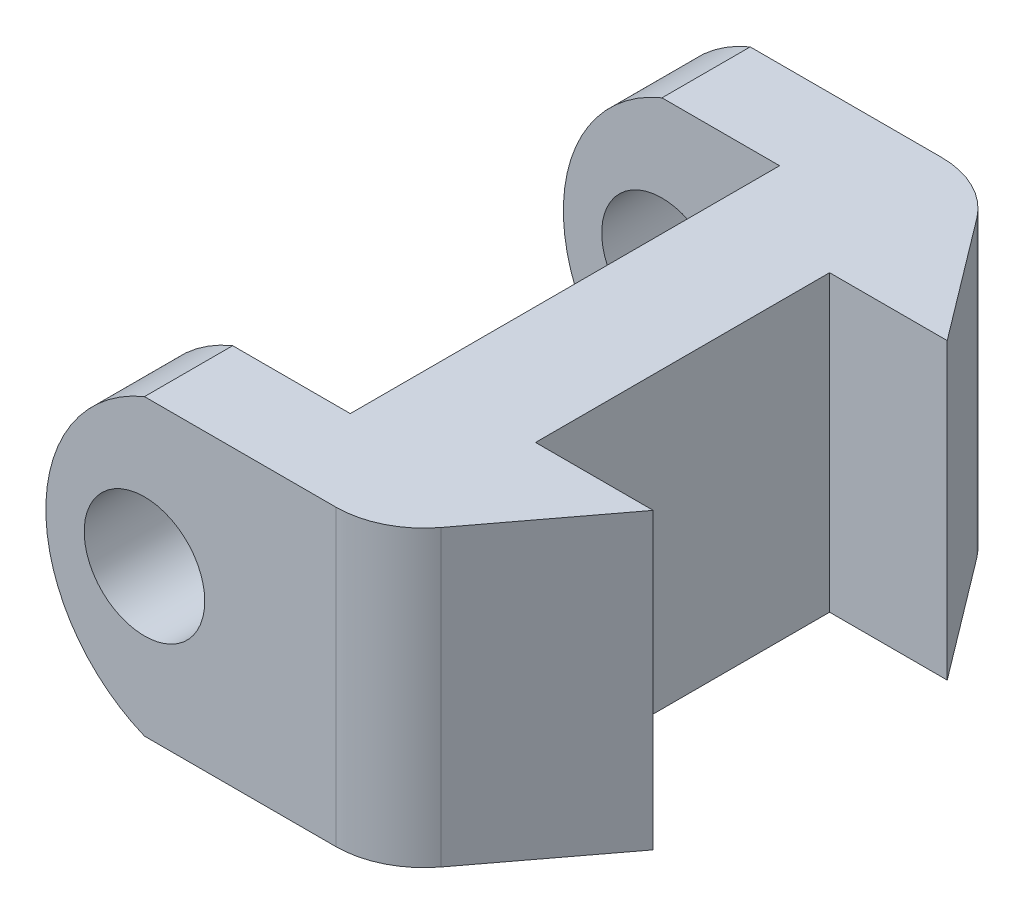
ISO-10303-21;
HEADER;
FILE_DESCRIPTION(('STEP AP214'),'2;1');
FILE_NAME('part.step','',(''),(''),'','','');
FILE_SCHEMA(('AUTOMOTIVE_DESIGN { 1 0 10303 214 1 1 1 1 }'));
ENDSEC;
DATA;
#1=APPLICATION_CONTEXT('core data for automotive mechanical design processes');
#2=APPLICATION_PROTOCOL_DEFINITION('international standard','automotive_design',2000,#1);
#3=PRODUCT_CONTEXT('',#1,'mechanical');
#4=PRODUCT('Part','Part','',(#3));
#5=PRODUCT_RELATED_PRODUCT_CATEGORY('part','',(#4));
#6=PRODUCT_DEFINITION_FORMATION('','',#4);
#7=PRODUCT_DEFINITION_CONTEXT('part definition',#1,'design');
#8=PRODUCT_DEFINITION('design','',#6,#7);
#9=PRODUCT_DEFINITION_SHAPE('','',#8);
#10=(LENGTH_UNIT() NAMED_UNIT(*) SI_UNIT(.MILLI.,.METRE.));
#11=(NAMED_UNIT(*) PLANE_ANGLE_UNIT() SI_UNIT($,.RADIAN.));
#12=(NAMED_UNIT(*) SI_UNIT($,.STERADIAN.) SOLID_ANGLE_UNIT());
#13=UNCERTAINTY_MEASURE_WITH_UNIT(LENGTH_MEASURE(1.E-05),#10,'distance_accuracy_value','');
#14=(GEOMETRIC_REPRESENTATION_CONTEXT(3) GLOBAL_UNCERTAINTY_ASSIGNED_CONTEXT((#13)) GLOBAL_UNIT_ASSIGNED_CONTEXT((#10,
#11,#12)) REPRESENTATION_CONTEXT('',''));
#15=CARTESIAN_POINT('',(0.,0.,0.));
#16=DIRECTION('',(0.,0.,1.));
#17=DIRECTION('',(1.,0.,0.));
#18=AXIS2_PLACEMENT_3D('',#15,#16,#17);
#19=CARTESIAN_POINT('',(0.,10.,-7.3));
#20=DIRECTION('',(0.,0.,1.));
#21=DIRECTION('',(1.,0.,0.));
#22=AXIS2_PLACEMENT_3D('',#19,#20,#21);
#23=PLANE('',#22);
#24=CARTESIAN_POINT('',(0.0499999999999997,5.,-7.3));
#25=DIRECTION('',(0.,0.,1.));
#26=DIRECTION('',(1.,0.,0.));
#27=AXIS2_PLACEMENT_3D('',#24,#25,#26);
#28=CIRCLE('',#27,5.40393375236966);
#29=CARTESIAN_POINT('',(-2.,0.,-7.29999999999999));
#30=VERTEX_POINT('',#29);
#31=CARTESIAN_POINT('',(-2.,10.,-7.29999999999999));
#32=VERTEX_POINT('',#31);
#33=EDGE_CURVE('E174',#30,#32,#28,.F.);
#34=ORIENTED_EDGE('',*,*,#33,.F.);
#35=DIRECTION('',(-1.,0.,0.));
#36=VECTOR('',#35,1.);
#37=CARTESIAN_POINT('',(0.,0.,-7.3));
#38=LINE('',#37,#36);
#39=CARTESIAN_POINT('',(2.,0.,-7.3));
#40=VERTEX_POINT('',#39);
#41=EDGE_CURVE('E222',#40,#30,#38,.T.);
#42=ORIENTED_EDGE('',*,*,#41,.F.);
#43=DIRECTION('',(0.,-1.,0.));
#44=VECTOR('',#43,1.);
#45=CARTESIAN_POINT('',(2.,10.,-7.3));
#46=LINE('',#45,#44);
#47=CARTESIAN_POINT('',(2.,10.,-7.3));
#48=VERTEX_POINT('',#47);
#49=EDGE_CURVE('E195',#48,#40,#46,.T.);
#50=ORIENTED_EDGE('',*,*,#49,.F.);
#51=DIRECTION('',(-1.,0.,0.));
#52=VECTOR('',#51,1.);
#53=CARTESIAN_POINT('',(0.,10.,-7.3));
#54=LINE('',#53,#52);
#55=EDGE_CURVE('E206',#48,#32,#54,.T.);
#56=ORIENTED_EDGE('',*,*,#55,.T.);
#57=EDGE_LOOP('',(#34,#42,#50,#56));
#58=FACE_BOUND('',#57,.T.);
#59=CARTESIAN_POINT('',(-2.,5.,-7.3));
#60=DIRECTION('',(0.,0.,1.));
#61=DIRECTION('',(1.,0.,0.));
#62=AXIS2_PLACEMENT_3D('',#59,#60,#61);
#63=CIRCLE('',#62,2.05);
#64=CARTESIAN_POINT('',(0.0500000000000006,5.,-7.3));
#65=VERTEX_POINT('',#64);
#66=EDGE_CURVE('E226',#65,#65,#63,.T.);
#67=ORIENTED_EDGE('',*,*,#66,.F.);
#68=EDGE_LOOP('',(#67));
#69=FACE_BOUND('',#68,.T.);
#70=ADVANCED_FACE('F41',(#58,#69),#23,.T.);
#71=CARTESIAN_POINT('',(2.,10.,0.));
#72=DIRECTION('',(-1.,0.,0.));
#73=DIRECTION('',(0.,0.,1.));
#74=AXIS2_PLACEMENT_3D('',#71,#72,#73);
#75=PLANE('',#74);
#76=DIRECTION('',(0.,0.,-1.));
#77=VECTOR('',#76,1.);
#78=CARTESIAN_POINT('',(2.,0.,0.));
#79=LINE('',#78,#77);
#80=CARTESIAN_POINT('',(2.,0.,7.3));
#81=VERTEX_POINT('',#80);
#82=EDGE_CURVE('E218',#81,#40,#79,.T.);
#83=ORIENTED_EDGE('',*,*,#82,.F.);
#84=DIRECTION('',(0.,-1.,0.));
#85=VECTOR('',#84,1.);
#86=CARTESIAN_POINT('',(2.,10.,7.3));
#87=LINE('',#86,#85);
#88=CARTESIAN_POINT('',(2.,10.,7.3));
#89=VERTEX_POINT('',#88);
#90=EDGE_CURVE('E198',#89,#81,#87,.T.);
#91=ORIENTED_EDGE('',*,*,#90,.F.);
#92=DIRECTION('',(0.,0.,-1.));
#93=VECTOR('',#92,1.);
#94=CARTESIAN_POINT('',(2.,10.,0.));
#95=LINE('',#94,#93);
#96=EDGE_CURVE('E239',#89,#48,#95,.T.);
#97=ORIENTED_EDGE('',*,*,#96,.T.);
#98=ORIENTED_EDGE('',*,*,#49,.T.);
#99=EDGE_LOOP('',(#83,#91,#97,#98));
#100=FACE_BOUND('',#99,.T.);
#101=ADVANCED_FACE('F353',(#100),#75,.T.);
#102=CARTESIAN_POINT('',(0.,10.,7.3));
#103=DIRECTION('',(0.,0.,1.));
#104=DIRECTION('',(1.,0.,0.));
#105=AXIS2_PLACEMENT_3D('',#102,#103,#104);
#106=PLANE('',#105);
#107=CARTESIAN_POINT('',(-2.,5.,7.3));
#108=DIRECTION('',(0.,0.,1.));
#109=DIRECTION('',(1.,0.,0.));
#110=AXIS2_PLACEMENT_3D('',#107,#108,#109);
#111=CIRCLE('',#110,2.05);
#112=CARTESIAN_POINT('',(0.0500000000000006,5.,7.3));
#113=VERTEX_POINT('',#112);
#114=EDGE_CURVE('E249',#113,#113,#111,.T.);
#115=ORIENTED_EDGE('',*,*,#114,.T.);
#116=EDGE_LOOP('',(#115));
#117=FACE_BOUND('',#116,.T.);
#118=DIRECTION('',(-1.,0.,0.));
#119=VECTOR('',#118,1.);
#120=CARTESIAN_POINT('',(0.,0.,7.3));
#121=LINE('',#120,#119);
#122=CARTESIAN_POINT('',(-1.99999999999999,0.,7.3));
#123=VERTEX_POINT('',#122);
#124=EDGE_CURVE('E214',#81,#123,#121,.T.);
#125=ORIENTED_EDGE('',*,*,#124,.T.);
#126=CARTESIAN_POINT('',(0.0499999999999997,5.,7.3));
#127=DIRECTION('',(0.,0.,1.));
#128=DIRECTION('',(1.,0.,0.));
#129=AXIS2_PLACEMENT_3D('',#126,#127,#128);
#130=CIRCLE('',#129,5.40393375236966);
#131=CARTESIAN_POINT('',(-2.,10.,7.3));
#132=VERTEX_POINT('',#131);
#133=EDGE_CURVE('E59',#123,#132,#130,.F.);
#134=ORIENTED_EDGE('',*,*,#133,.T.);
#135=DIRECTION('',(-1.,0.,0.));
#136=VECTOR('',#135,1.);
#137=CARTESIAN_POINT('',(0.,10.,7.3));
#138=LINE('',#137,#136);
#139=EDGE_CURVE('E235',#89,#132,#138,.T.);
#140=ORIENTED_EDGE('',*,*,#139,.F.);
#141=ORIENTED_EDGE('',*,*,#90,.T.);
#142=EDGE_LOOP('',(#125,#134,#140,#141));
#143=FACE_BOUND('',#142,.T.);
#144=ADVANCED_FACE('F356',(#117,#143),#106,.F.);
#145=CARTESIAN_POINT('',(0.,10.,10.3));
#146=DIRECTION('',(0.,0.,1.));
#147=DIRECTION('',(1.,0.,0.));
#148=AXIS2_PLACEMENT_3D('',#145,#146,#147);
#149=PLANE('',#148);
#150=CARTESIAN_POINT('',(0.0499999999999997,5.,10.3));
#151=DIRECTION('',(0.,0.,1.));
#152=DIRECTION('',(1.,0.,0.));
#153=AXIS2_PLACEMENT_3D('',#150,#151,#152);
#154=CIRCLE('',#153,5.40393375236966);
#155=CARTESIAN_POINT('',(-2.,10.,10.3));
#156=VERTEX_POINT('',#155);
#157=CARTESIAN_POINT('',(-2.,0.,10.3));
#158=VERTEX_POINT('',#157);
#159=EDGE_CURVE('E307',#156,#158,#154,.T.);
#160=ORIENTED_EDGE('',*,*,#159,.T.);
#161=DIRECTION('',(-1.,0.,0.));
#162=VECTOR('',#161,1.);
#163=CARTESIAN_POINT('',(0.,0.,10.3));
#164=LINE('',#163,#162);
#165=CARTESIAN_POINT('',(4.50564332806777,0.,10.3));
#166=VERTEX_POINT('',#165);
#167=EDGE_CURVE('E210',#166,#158,#164,.T.);
#168=ORIENTED_EDGE('',*,*,#167,.F.);
#169=DIRECTION('',(0.,-1.,0.));
#170=VECTOR('',#169,1.);
#171=CARTESIAN_POINT('',(4.50564332806777,10.,10.3));
#172=LINE('',#171,#170);
#173=CARTESIAN_POINT('',(4.50564332806777,10.,10.3));
#174=VERTEX_POINT('',#173);
#175=EDGE_CURVE('E52',#166,#174,#172,.F.);
#176=ORIENTED_EDGE('',*,*,#175,.T.);
#177=DIRECTION('',(-1.,0.,0.));
#178=VECTOR('',#177,1.);
#179=CARTESIAN_POINT('',(0.,10.,10.3));
#180=LINE('',#179,#178);
#181=EDGE_CURVE('E158',#174,#156,#180,.T.);
#182=ORIENTED_EDGE('',*,*,#181,.T.);
#183=EDGE_LOOP('',(#160,#168,#176,#182));
#184=FACE_BOUND('',#183,.T.);
#185=CARTESIAN_POINT('',(-2.,5.,10.3));
#186=DIRECTION('',(0.,0.,1.));
#187=DIRECTION('',(1.,0.,0.));
#188=AXIS2_PLACEMENT_3D('',#185,#186,#187);
#189=CIRCLE('',#188,2.05);
#190=CARTESIAN_POINT('',(0.0500000000000006,5.,10.3));
#191=VERTEX_POINT('',#190);
#192=EDGE_CURVE('E257',#191,#191,#189,.T.);
#193=ORIENTED_EDGE('',*,*,#192,.F.);
#194=EDGE_LOOP('',(#193));
#195=FACE_BOUND('',#194,.T.);
#196=ADVANCED_FACE('F315',(#184,#195),#149,.T.);
#197=CARTESIAN_POINT('',(6.,10.,0.));
#198=DIRECTION('',(-1.,0.,0.));
#199=DIRECTION('',(0.,0.,1.));
#200=AXIS2_PLACEMENT_3D('',#197,#198,#199);
#201=PLANE('',#200);
#202=DIRECTION('',(0.,0.,-1.));
#203=VECTOR('',#202,1.);
#204=CARTESIAN_POINT('',(6.,10.,0.));
#205=LINE('',#204,#203);
#206=CARTESIAN_POINT('',(6.,10.,5.));
#207=VERTEX_POINT('',#206);
#208=CARTESIAN_POINT('',(6.,10.,-5.));
#209=VERTEX_POINT('',#208);
#210=EDGE_CURVE('E230',#207,#209,#205,.T.);
#211=ORIENTED_EDGE('',*,*,#210,.F.);
#212=DIRECTION('',(0.,1.,0.));
#213=VECTOR('',#212,1.);
#214=CARTESIAN_POINT('',(6.,-6.64003012041361,5.));
#215=LINE('',#214,#213);
#216=CARTESIAN_POINT('',(6.,0.,5.));
#217=VERTEX_POINT('',#216);
#218=EDGE_CURVE('E291',#217,#207,#215,.T.);
#219=ORIENTED_EDGE('',*,*,#218,.F.);
#220=DIRECTION('',(0.,0.,-1.));
#221=VECTOR('',#220,1.);
#222=CARTESIAN_POINT('',(6.,0.,0.));
#223=LINE('',#222,#221);
#224=CARTESIAN_POINT('',(6.,0.,-5.));
#225=VERTEX_POINT('',#224);
#226=EDGE_CURVE('E207',#217,#225,#223,.T.);
#227=ORIENTED_EDGE('',*,*,#226,.T.);
#228=DIRECTION('',(0.,1.,0.));
#229=VECTOR('',#228,1.);
#230=CARTESIAN_POINT('',(6.,-6.64003012041361,-5.));
#231=LINE('',#230,#229);
#232=EDGE_CURVE('E266',#225,#209,#231,.T.);
#233=ORIENTED_EDGE('',*,*,#232,.T.);
#234=EDGE_LOOP('',(#211,#219,#227,#233));
#235=FACE_BOUND('',#234,.T.);
#236=ADVANCED_FACE('F332',(#235),#201,.F.);
#237=CARTESIAN_POINT('',(0.,10.,-10.3));
#238=DIRECTION('',(0.,0.,1.));
#239=DIRECTION('',(1.,0.,0.));
#240=AXIS2_PLACEMENT_3D('',#237,#238,#239);
#241=PLANE('',#240);
#242=CARTESIAN_POINT('',(-2.,5.,-10.3));
#243=DIRECTION('',(0.,0.,1.));
#244=DIRECTION('',(1.,0.,0.));
#245=AXIS2_PLACEMENT_3D('',#242,#243,#244);
#246=CIRCLE('',#245,2.05);
#247=CARTESIAN_POINT('',(0.0500000000000006,5.,-10.3));
#248=VERTEX_POINT('',#247);
#249=EDGE_CURVE('E253',#248,#248,#246,.T.);
#250=ORIENTED_EDGE('',*,*,#249,.T.);
#251=EDGE_LOOP('',(#250));
#252=FACE_BOUND('',#251,.T.);
#253=DIRECTION('',(-1.,0.,0.));
#254=VECTOR('',#253,1.);
#255=CARTESIAN_POINT('',(0.,0.,-10.3));
#256=LINE('',#255,#254);
#257=CARTESIAN_POINT('',(4.50564332806777,0.,-10.3));
#258=VERTEX_POINT('',#257);
#259=CARTESIAN_POINT('',(-1.99999999999999,0.,-10.3));
#260=VERTEX_POINT('',#259);
#261=EDGE_CURVE('E202',#258,#260,#256,.T.);
#262=ORIENTED_EDGE('',*,*,#261,.T.);
#263=CARTESIAN_POINT('',(0.0499999999999997,5.,-10.3));
#264=DIRECTION('',(0.,0.,-1.));
#265=DIRECTION('',(-1.,0.,0.));
#266=AXIS2_PLACEMENT_3D('',#263,#264,#265);
#267=CIRCLE('',#266,5.40393375236966);
#268=CARTESIAN_POINT('',(-2.,10.,-10.3));
#269=VERTEX_POINT('',#268);
#270=EDGE_CURVE('E45',#269,#260,#267,.F.);
#271=ORIENTED_EDGE('',*,*,#270,.F.);
#272=DIRECTION('',(-1.,0.,0.));
#273=VECTOR('',#272,1.);
#274=CARTESIAN_POINT('',(0.,10.,-10.3));
#275=LINE('',#274,#273);
#276=CARTESIAN_POINT('',(4.50564332806777,10.,-10.3));
#277=VERTEX_POINT('',#276);
#278=EDGE_CURVE('E201',#277,#269,#275,.T.);
#279=ORIENTED_EDGE('',*,*,#278,.F.);
#280=DIRECTION('',(0.,-1.,0.));
#281=VECTOR('',#280,1.);
#282=CARTESIAN_POINT('',(4.50564332806777,10.,-10.3));
#283=LINE('',#282,#281);
#284=EDGE_CURVE('E191',#277,#258,#283,.T.);
#285=ORIENTED_EDGE('',*,*,#284,.T.);
#286=EDGE_LOOP('',(#262,#271,#279,#285));
#287=FACE_BOUND('',#286,.T.);
#288=ADVANCED_FACE('F343',(#252,#287),#241,.F.);
#289=CARTESIAN_POINT('',(0.,10.,0.));
#290=DIRECTION('',(0.,1.,0.));
#291=DIRECTION('',(0.,0.,1.));
#292=AXIS2_PLACEMENT_3D('',#289,#290,#291);
#293=PLANE('',#292);
#294=DIRECTION('',(0.,0.,-1.));
#295=VECTOR('',#294,1.);
#296=CARTESIAN_POINT('',(-2.,10.,10.3));
#297=LINE('',#296,#295);
#298=EDGE_CURVE('E311',#156,#132,#297,.T.);
#299=ORIENTED_EDGE('',*,*,#298,.F.);
#300=ORIENTED_EDGE('',*,*,#181,.F.);
#301=CARTESIAN_POINT('',(4.50564332806777,10.,7.3));
#302=DIRECTION('',(0.,1.,0.));
#303=DIRECTION('',(0.,0.,1.));
#304=AXIS2_PLACEMENT_3D('',#301,#302,#303);
#305=CIRCLE('',#304,3.);
#306=CARTESIAN_POINT('',(6.90021077906746,10.,9.10722071773562));
#307=VERTEX_POINT('',#306);
#308=EDGE_CURVE('E151',#174,#307,#305,.T.);
#309=ORIENTED_EDGE('',*,*,#308,.T.);
#310=DIRECTION('',(-0.602406905911873,0.,0.79818915033323));
#311=VECTOR('',#310,1.);
#312=CARTESIAN_POINT('',(8.77523247902019,10.,6.62281696529826));
#313=LINE('',#312,#311);
#314=CARTESIAN_POINT('',(10.,10.,5.));
#315=VERTEX_POINT('',#314);
#316=EDGE_CURVE('E156',#315,#307,#313,.T.);
#317=ORIENTED_EDGE('',*,*,#316,.F.);
#318=DIRECTION('',(-1.,0.,0.));
#319=VECTOR('',#318,1.);
#320=CARTESIAN_POINT('',(0.,10.,5.));
#321=LINE('',#320,#319);
#322=EDGE_CURVE('E173',#315,#207,#321,.T.);
#323=ORIENTED_EDGE('',*,*,#322,.T.);
#324=ORIENTED_EDGE('',*,*,#210,.T.);
#325=DIRECTION('',(-1.,0.,0.));
#326=VECTOR('',#325,1.);
#327=CARTESIAN_POINT('',(0.,10.,-5.));
#328=LINE('',#327,#326);
#329=CARTESIAN_POINT('',(10.,10.,-5.));
#330=VERTEX_POINT('',#329);
#331=EDGE_CURVE('E277',#330,#209,#328,.T.);
#332=ORIENTED_EDGE('',*,*,#331,.F.);
#333=DIRECTION('',(0.602406905911873,0.,0.79818915033323));
#334=VECTOR('',#333,1.);
#335=CARTESIAN_POINT('',(8.77523247902019,10.,-6.62281696529826));
#336=LINE('',#335,#334);
#337=CARTESIAN_POINT('',(6.90021077906746,10.,-9.10722071773562));
#338=VERTEX_POINT('',#337);
#339=EDGE_CURVE('E271',#338,#330,#336,.T.);
#340=ORIENTED_EDGE('',*,*,#339,.F.);
#341=CARTESIAN_POINT('',(4.50564332806777,10.,-7.3));
#342=DIRECTION('',(0.,1.,0.));
#343=DIRECTION('',(0.,0.,1.));
#344=AXIS2_PLACEMENT_3D('',#341,#342,#343);
#345=CIRCLE('',#344,3.);
#346=EDGE_CURVE('E162',#338,#277,#345,.T.);
#347=ORIENTED_EDGE('',*,*,#346,.T.);
#348=ORIENTED_EDGE('',*,*,#278,.T.);
#349=EDGE_CURVE('E71',#32,#269,#297,.T.);
#350=ORIENTED_EDGE('',*,*,#349,.F.);
#351=ORIENTED_EDGE('',*,*,#55,.F.);
#352=ORIENTED_EDGE('',*,*,#96,.F.);
#353=ORIENTED_EDGE('',*,*,#139,.T.);
#354=EDGE_LOOP('',(#299,#300,#309,#317,#323,#324,#332,#340,#347,#348,#350,#351,#352,#353));
#355=FACE_BOUND('',#354,.T.);
#356=ADVANCED_FACE('F154',(#355),#293,.T.);
#357=CARTESIAN_POINT('',(0.,0.,0.));
#358=DIRECTION('',(0.,1.,0.));
#359=DIRECTION('',(0.,0.,1.));
#360=AXIS2_PLACEMENT_3D('',#357,#358,#359);
#361=PLANE('',#360);
#362=ORIENTED_EDGE('',*,*,#167,.T.);
#363=DIRECTION('',(0.,0.,-1.));
#364=VECTOR('',#363,1.);
#365=CARTESIAN_POINT('',(-2.,0.,10.3));
#366=LINE('',#365,#364);
#367=EDGE_CURVE('E76',#158,#123,#366,.T.);
#368=ORIENTED_EDGE('',*,*,#367,.T.);
#369=ORIENTED_EDGE('',*,*,#124,.F.);
#370=ORIENTED_EDGE('',*,*,#82,.T.);
#371=ORIENTED_EDGE('',*,*,#41,.T.);
#372=DIRECTION('',(0.,0.,-1.));
#373=VECTOR('',#372,1.);
#374=CARTESIAN_POINT('',(-1.99999999999999,0.,10.3));
#375=LINE('',#374,#373);
#376=EDGE_CURVE('E11',#30,#260,#375,.T.);
#377=ORIENTED_EDGE('',*,*,#376,.T.);
#378=ORIENTED_EDGE('',*,*,#261,.F.);
#379=CARTESIAN_POINT('',(4.50564332806777,0.,-7.3));
#380=DIRECTION('',(0.,1.,0.));
#381=DIRECTION('',(0.,0.,1.));
#382=AXIS2_PLACEMENT_3D('',#379,#380,#381);
#383=CIRCLE('',#382,3.);
#384=CARTESIAN_POINT('',(6.90021077906746,0.,-9.10722071773562));
#385=VERTEX_POINT('',#384);
#386=EDGE_CURVE('E186',#258,#385,#383,.F.);
#387=ORIENTED_EDGE('',*,*,#386,.T.);
#388=DIRECTION('',(-0.602406905911873,0.,-0.798189150333231));
#389=VECTOR('',#388,1.);
#390=CARTESIAN_POINT('',(8.77523247902019,0.,-6.62281696529826));
#391=LINE('',#390,#389);
#392=CARTESIAN_POINT('',(10.,0.,-5.));
#393=VERTEX_POINT('',#392);
#394=EDGE_CURVE('E262',#393,#385,#391,.T.);
#395=ORIENTED_EDGE('',*,*,#394,.F.);
#396=DIRECTION('',(1.,0.,0.));
#397=VECTOR('',#396,1.);
#398=CARTESIAN_POINT('',(0.,0.,-5.));
#399=LINE('',#398,#397);
#400=EDGE_CURVE('E261',#225,#393,#399,.T.);
#401=ORIENTED_EDGE('',*,*,#400,.F.);
#402=ORIENTED_EDGE('',*,*,#226,.F.);
#403=DIRECTION('',(1.,0.,0.));
#404=VECTOR('',#403,1.);
#405=CARTESIAN_POINT('',(0.,0.,5.));
#406=LINE('',#405,#404);
#407=CARTESIAN_POINT('',(10.,0.,5.));
#408=VERTEX_POINT('',#407);
#409=EDGE_CURVE('E281',#217,#408,#406,.T.);
#410=ORIENTED_EDGE('',*,*,#409,.T.);
#411=DIRECTION('',(0.602406905911873,0.,-0.798189150333231));
#412=VECTOR('',#411,1.);
#413=CARTESIAN_POINT('',(8.77523247902019,0.,6.62281696529826));
#414=LINE('',#413,#412);
#415=CARTESIAN_POINT('',(6.90021077906746,0.,9.10722071773562));
#416=VERTEX_POINT('',#415);
#417=EDGE_CURVE('E288',#416,#408,#414,.T.);
#418=ORIENTED_EDGE('',*,*,#417,.F.);
#419=CARTESIAN_POINT('',(4.50564332806777,0.,7.3));
#420=DIRECTION('',(0.,1.,0.));
#421=DIRECTION('',(0.,0.,1.));
#422=AXIS2_PLACEMENT_3D('',#419,#420,#421);
#423=CIRCLE('',#422,3.);
#424=EDGE_CURVE('E176',#416,#166,#423,.F.);
#425=ORIENTED_EDGE('',*,*,#424,.T.);
#426=EDGE_LOOP('',(#362,#368,#369,#370,#371,#377,#378,#387,#395,#401,#402,#410,#418,#425));
#427=FACE_BOUND('',#426,.T.);
#428=ADVANCED_FACE('F318',(#427),#361,.F.);
#429=CARTESIAN_POINT('',(-2.,5.,-10.3));
#430=DIRECTION('',(0.,0.,1.));
#431=DIRECTION('',(1.,0.,0.));
#432=AXIS2_PLACEMENT_3D('',#429,#430,#431);
#433=CYLINDRICAL_SURFACE('',#432,2.05);
#434=ORIENTED_EDGE('',*,*,#66,.T.);
#435=EDGE_LOOP('',(#434));
#436=FACE_BOUND('',#435,.T.);
#437=ORIENTED_EDGE('',*,*,#249,.F.);
#438=EDGE_LOOP('',(#437));
#439=FACE_BOUND('',#438,.T.);
#440=ADVANCED_FACE('F386',(#436,#439),#433,.F.);
#441=ORIENTED_EDGE('',*,*,#192,.T.);
#442=EDGE_LOOP('',(#441));
#443=FACE_BOUND('',#442,.T.);
#444=ORIENTED_EDGE('',*,*,#114,.F.);
#445=EDGE_LOOP('',(#444));
#446=FACE_BOUND('',#445,.T.);
#447=ADVANCED_FACE('F383',(#443,#446),#433,.F.);
#448=CARTESIAN_POINT('',(8.77523247902019,-6.64003012041361,-6.62281696529826));
#449=DIRECTION('',(-0.79818915033323,0.,0.602406905911873));
#450=DIRECTION('',(0.602406905911873,0.,0.798189150333231));
#451=AXIS2_PLACEMENT_3D('',#448,#449,#450);
#452=PLANE('',#451);
#453=ORIENTED_EDGE('',*,*,#394,.T.);
#454=DIRECTION('',(0.,-1.,0.));
#455=VECTOR('',#454,1.);
#456=CARTESIAN_POINT('',(6.90021077906746,-6.64003012041361,-9.10722071773562));
#457=LINE('',#456,#455);
#458=EDGE_CURVE('E163',#385,#338,#457,.F.);
#459=ORIENTED_EDGE('',*,*,#458,.T.);
#460=ORIENTED_EDGE('',*,*,#339,.T.);
#461=DIRECTION('',(0.,1.,0.));
#462=VECTOR('',#461,1.);
#463=CARTESIAN_POINT('',(10.,-6.64003012041361,-5.));
#464=LINE('',#463,#462);
#465=EDGE_CURVE('E267',#393,#330,#464,.T.);
#466=ORIENTED_EDGE('',*,*,#465,.F.);
#467=EDGE_LOOP('',(#453,#459,#460,#466));
#468=FACE_BOUND('',#467,.T.);
#469=ADVANCED_FACE('F334',(#468),#452,.F.);
#470=CARTESIAN_POINT('',(0.,-6.64003012041361,-5.));
#471=DIRECTION('',(0.,0.,-1.));
#472=DIRECTION('',(-1.,0.,0.));
#473=AXIS2_PLACEMENT_3D('',#470,#471,#472);
#474=PLANE('',#473);
#475=ORIENTED_EDGE('',*,*,#232,.F.);
#476=ORIENTED_EDGE('',*,*,#400,.T.);
#477=ORIENTED_EDGE('',*,*,#465,.T.);
#478=ORIENTED_EDGE('',*,*,#331,.T.);
#479=EDGE_LOOP('',(#475,#476,#477,#478));
#480=FACE_BOUND('',#479,.T.);
#481=ADVANCED_FACE('F330',(#480),#474,.F.);
#482=CARTESIAN_POINT('',(8.77523247902019,-6.64003012041361,6.62281696529826));
#483=DIRECTION('',(-0.79818915033323,0.,-0.602406905911873));
#484=DIRECTION('',(-0.602406905911873,0.,0.798189150333231));
#485=AXIS2_PLACEMENT_3D('',#482,#483,#484);
#486=PLANE('',#485);
#487=ORIENTED_EDGE('',*,*,#316,.T.);
#488=DIRECTION('',(0.,-1.,0.));
#489=VECTOR('',#488,1.);
#490=CARTESIAN_POINT('',(6.90021077906746,0.,9.10722071773562));
#491=LINE('',#490,#489);
#492=EDGE_CURVE('E168',#307,#416,#491,.T.);
#493=ORIENTED_EDGE('',*,*,#492,.T.);
#494=ORIENTED_EDGE('',*,*,#417,.T.);
#495=DIRECTION('',(0.,1.,0.));
#496=VECTOR('',#495,1.);
#497=CARTESIAN_POINT('',(10.,-6.64003012041361,5.));
#498=LINE('',#497,#496);
#499=EDGE_CURVE('E171',#408,#315,#498,.T.);
#500=ORIENTED_EDGE('',*,*,#499,.T.);
#501=EDGE_LOOP('',(#487,#493,#494,#500));
#502=FACE_BOUND('',#501,.T.);
#503=ADVANCED_FACE('F167',(#502),#486,.F.);
#504=CARTESIAN_POINT('',(0.,-6.64003012041361,5.));
#505=DIRECTION('',(0.,0.,-1.));
#506=DIRECTION('',(-1.,0.,0.));
#507=AXIS2_PLACEMENT_3D('',#504,#505,#506);
#508=PLANE('',#507);
#509=ORIENTED_EDGE('',*,*,#409,.F.);
#510=ORIENTED_EDGE('',*,*,#218,.T.);
#511=ORIENTED_EDGE('',*,*,#322,.F.);
#512=ORIENTED_EDGE('',*,*,#499,.F.);
#513=EDGE_LOOP('',(#509,#510,#511,#512));
#514=FACE_BOUND('',#513,.T.);
#515=ADVANCED_FACE('F324',(#514),#508,.T.);
#516=CARTESIAN_POINT('',(4.50564332806777,10.,-7.3));
#517=DIRECTION('',(0.,-1.,0.));
#518=DIRECTION('',(0.,0.,-1.));
#519=AXIS2_PLACEMENT_3D('',#516,#517,#518);
#520=CYLINDRICAL_SURFACE('',#519,3.);
#521=ORIENTED_EDGE('',*,*,#346,.F.);
#522=ORIENTED_EDGE('',*,*,#458,.F.);
#523=ORIENTED_EDGE('',*,*,#386,.F.);
#524=ORIENTED_EDGE('',*,*,#284,.F.);
#525=EDGE_LOOP('',(#521,#522,#523,#524));
#526=FACE_BOUND('',#525,.T.);
#527=ADVANCED_FACE('F340',(#526),#520,.T.);
#528=CARTESIAN_POINT('',(4.50564332806777,-6.64003012041361,7.3));
#529=DIRECTION('',(0.,1.,0.));
#530=DIRECTION('',(0.,0.,1.));
#531=AXIS2_PLACEMENT_3D('',#528,#529,#530);
#532=CYLINDRICAL_SURFACE('',#531,3.);
#533=ORIENTED_EDGE('',*,*,#308,.F.);
#534=ORIENTED_EDGE('',*,*,#175,.F.);
#535=ORIENTED_EDGE('',*,*,#424,.F.);
#536=ORIENTED_EDGE('',*,*,#492,.F.);
#537=EDGE_LOOP('',(#533,#534,#535,#536));
#538=FACE_BOUND('',#537,.T.);
#539=ADVANCED_FACE('F43',(#538),#532,.T.);
#540=CARTESIAN_POINT('',(0.0499999999999997,5.,10.3));
#541=DIRECTION('',(0.,0.,-1.));
#542=DIRECTION('',(-1.,0.,0.));
#543=AXIS2_PLACEMENT_3D('',#540,#541,#542);
#544=CYLINDRICAL_SURFACE('',#543,5.40393375236966);
#545=ORIENTED_EDGE('',*,*,#33,.T.);
#546=ORIENTED_EDGE('',*,*,#349,.T.);
#547=ORIENTED_EDGE('',*,*,#270,.T.);
#548=ORIENTED_EDGE('',*,*,#376,.F.);
#549=EDGE_LOOP('',(#545,#546,#547,#548));
#550=FACE_BOUND('',#549,.T.);
#551=ADVANCED_FACE('F346',(#550),#544,.T.);
#552=ORIENTED_EDGE('',*,*,#367,.F.);
#553=ORIENTED_EDGE('',*,*,#159,.F.);
#554=ORIENTED_EDGE('',*,*,#298,.T.);
#555=ORIENTED_EDGE('',*,*,#133,.F.);
#556=EDGE_LOOP('',(#552,#553,#554,#555));
#557=FACE_BOUND('',#556,.T.);
#558=ADVANCED_FACE('F357',(#557),#544,.T.);
#559=CLOSED_SHELL('',(#70,#101,#144,#196,#236,#288,#356,#428,#440,#447,#469,#481,#503,#515,#527,
#539,#551,#558));
#560=MANIFOLD_SOLID_BREP('B2',#559);
#561=ADVANCED_BREP_SHAPE_REPRESENTATION('',(#18,#560),#14);
#562=SHAPE_DEFINITION_REPRESENTATION(#9,#561);
ENDSEC;
END-ISO-10303-21;
